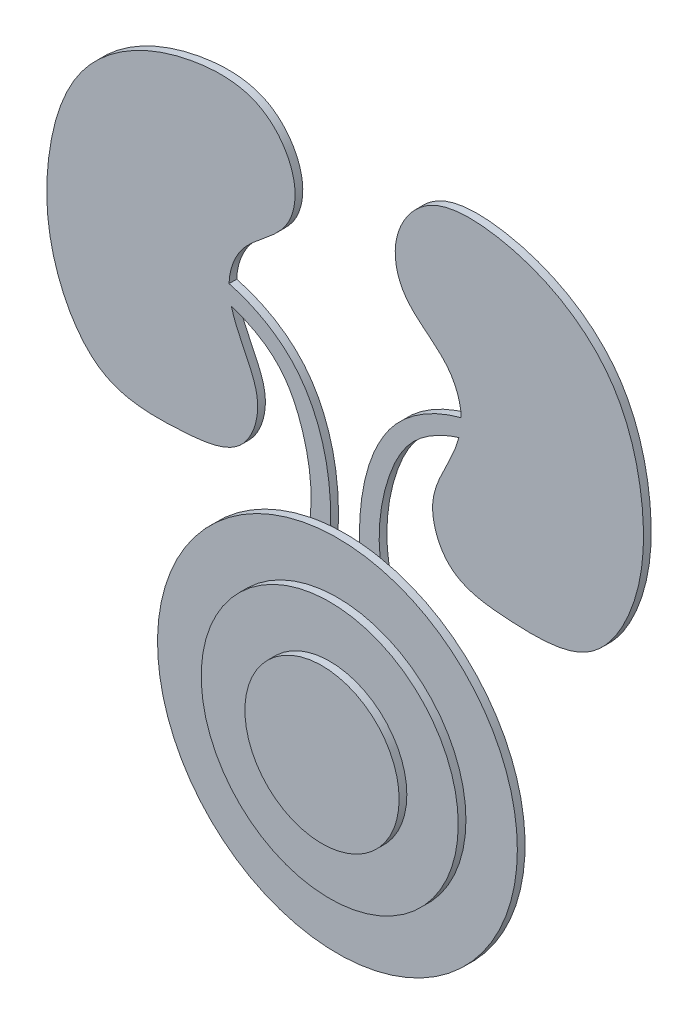
ISO-10303-21;
HEADER;
FILE_DESCRIPTION(('STEP AP214'),'2;1');
FILE_NAME('part.step','',(''),(''),'','','');
FILE_SCHEMA(('AUTOMOTIVE_DESIGN { 1 0 10303 214 1 1 1 1 }'));
ENDSEC;
DATA;
#1=APPLICATION_CONTEXT('core data for automotive mechanical design processes');
#2=APPLICATION_PROTOCOL_DEFINITION('international standard','automotive_design',2000,#1);
#3=PRODUCT_CONTEXT('',#1,'mechanical');
#4=PRODUCT('Part','Part','',(#3));
#5=PRODUCT_RELATED_PRODUCT_CATEGORY('part','',(#4));
#6=PRODUCT_DEFINITION_FORMATION('','',#4);
#7=PRODUCT_DEFINITION_CONTEXT('part definition',#1,'design');
#8=PRODUCT_DEFINITION('design','',#6,#7);
#9=PRODUCT_DEFINITION_SHAPE('','',#8);
#10=(LENGTH_UNIT() NAMED_UNIT(*) SI_UNIT(.MILLI.,.METRE.));
#11=(NAMED_UNIT(*) PLANE_ANGLE_UNIT() SI_UNIT($,.RADIAN.));
#12=(NAMED_UNIT(*) SI_UNIT($,.STERADIAN.) SOLID_ANGLE_UNIT());
#13=UNCERTAINTY_MEASURE_WITH_UNIT(LENGTH_MEASURE(1.E-05),#10,'distance_accuracy_value','');
#14=(GEOMETRIC_REPRESENTATION_CONTEXT(3) GLOBAL_UNCERTAINTY_ASSIGNED_CONTEXT((#13)) GLOBAL_UNIT_ASSIGNED_CONTEXT((#10,
#11,#12)) REPRESENTATION_CONTEXT('',''));
#15=CARTESIAN_POINT('',(0.,0.,0.));
#16=DIRECTION('',(0.,0.,1.));
#17=DIRECTION('',(1.,0.,0.));
#18=AXIS2_PLACEMENT_3D('',#15,#16,#17);
#19=CARTESIAN_POINT('',(-9.72641036774746,-28.6008671319991,-3.));
#20=CARTESIAN_POINT('',(-6.62218246305213,-15.5932633905993,-3.));
#21=CARTESIAN_POINT('',(-4.06444870774678,3.85284465866499,-3.));
#22=CARTESIAN_POINT('',(-8.51745088980813,30.2587786231955,-3.));
#23=CARTESIAN_POINT('',(-19.2033270279585,51.8847771164205,-3.));
#24=CARTESIAN_POINT('',(-35.5749175991955,60.7058344037227,-3.));
#25=CARTESIAN_POINT('',(-45.1693890236413,63.2318053031753,-3.));
#26=B_SPLINE_CURVE_WITH_KNOTS('',3,(#19,#20,#21,#22,#23,#24,#25),.UNSPECIFIED.,.F.,.F.,(4,1,1,1,
4),(0.,0.366558686155692,0.523455340740616,0.727102845018313,1.),.UNSPECIFIED.);
#27=DIRECTION('',(0.,0.,1.));
#28=VECTOR('',#27,1.);
#29=SURFACE_OF_LINEAR_EXTRUSION('',#26,#28);
#30=CARTESIAN_POINT('',(-9.72641036774746,-28.6008671319991,0.));
#31=CARTESIAN_POINT('',(-6.62218246305213,-15.5932633905993,0.));
#32=CARTESIAN_POINT('',(-4.06444870774678,3.85284465866499,0.));
#33=CARTESIAN_POINT('',(-8.51745088980813,30.2587786231955,0.));
#34=CARTESIAN_POINT('',(-19.2033270279585,51.8847771164205,0.));
#35=CARTESIAN_POINT('',(-35.5749175991955,60.7058344037227,0.));
#36=CARTESIAN_POINT('',(-45.1693890236413,63.2318053031753,0.));
#37=B_SPLINE_CURVE_WITH_KNOTS('',3,(#30,#31,#32,#33,#34,#35,#36),.UNSPECIFIED.,.F.,.F.,(4,1,1,1,
4),(0.,0.366558686155692,0.523455340740616,0.727102845018313,1.),.UNSPECIFIED.);
#38=CARTESIAN_POINT('',(-9.72641036774746,-28.6008671319991,0.));
#39=VERTEX_POINT('',#38);
#40=CARTESIAN_POINT('',(-5.59542977148809,1.38331897960272,0.));
#41=VERTEX_POINT('',#40);
#42=EDGE_CURVE('E205',#39,#41,#37,.T.);
#43=ORIENTED_EDGE('',*,*,#42,.F.);
#44=DIRECTION('',(0.,0.,1.));
#45=VECTOR('',#44,1.);
#46=CARTESIAN_POINT('',(-9.72641036774746,-28.6008671319991,-3.));
#47=LINE('',#46,#45);
#48=CARTESIAN_POINT('',(-9.72641036774746,-28.6008671319991,-3.));
#49=VERTEX_POINT('',#48);
#50=EDGE_CURVE('E234',#49,#39,#47,.T.);
#51=ORIENTED_EDGE('',*,*,#50,.F.);
#52=CARTESIAN_POINT('',(-45.1693890236413,63.2318053031753,-3.));
#53=VERTEX_POINT('',#52);
#54=EDGE_CURVE('E233',#49,#53,#26,.T.);
#55=ORIENTED_EDGE('',*,*,#54,.T.);
#56=DIRECTION('',(0.,0.,1.));
#57=VECTOR('',#56,1.);
#58=CARTESIAN_POINT('',(-45.1693890236413,63.2318053031753,-3.));
#59=LINE('',#58,#57);
#60=CARTESIAN_POINT('',(-45.1693890236413,63.2318053031753,0.));
#61=VERTEX_POINT('',#60);
#62=EDGE_CURVE('E36',#53,#61,#59,.T.);
#63=ORIENTED_EDGE('',*,*,#62,.T.);
#64=EDGE_CURVE('E211',#41,#61,#37,.T.);
#65=ORIENTED_EDGE('',*,*,#64,.F.);
#66=EDGE_LOOP('',(#43,#51,#55,#63,#65));
#67=FACE_BOUND('',#66,.T.);
#68=ADVANCED_FACE('F32',(#67),#29,.T.);
#69=CARTESIAN_POINT('',(-28.8302910399665,-28.6008671319991,-3.));
#70=DIRECTION('',(0.,-1.,0.));
#71=DIRECTION('',(0.,0.,-1.));
#72=AXIS2_PLACEMENT_3D('',#69,#70,#71);
#73=PLANE('',#72);
#74=DIRECTION('',(1.,0.,0.));
#75=VECTOR('',#74,1.);
#76=CARTESIAN_POINT('',(-28.8302910399665,-28.6008671319991,0.));
#77=LINE('',#76,#75);
#78=CARTESIAN_POINT('',(-28.8302910399665,-28.6008671319991,0.));
#79=VERTEX_POINT('',#78);
#80=EDGE_CURVE('E227',#79,#39,#77,.T.);
#81=ORIENTED_EDGE('',*,*,#80,.F.);
#82=DIRECTION('',(0.,0.,1.));
#83=VECTOR('',#82,1.);
#84=CARTESIAN_POINT('',(-28.8302910399665,-28.6008671319991,-3.));
#85=LINE('',#84,#83);
#86=CARTESIAN_POINT('',(-28.8302910399665,-28.6008671319991,-3.));
#87=VERTEX_POINT('',#86);
#88=EDGE_CURVE('E236',#87,#79,#85,.T.);
#89=ORIENTED_EDGE('',*,*,#88,.F.);
#90=DIRECTION('',(1.,0.,0.));
#91=VECTOR('',#90,1.);
#92=CARTESIAN_POINT('',(-28.8302910399665,-28.6008671319991,-3.));
#93=LINE('',#92,#91);
#94=EDGE_CURVE('E195',#87,#49,#93,.T.);
#95=ORIENTED_EDGE('',*,*,#94,.T.);
#96=ORIENTED_EDGE('',*,*,#50,.T.);
#97=EDGE_LOOP('',(#81,#89,#95,#96));
#98=FACE_BOUND('',#97,.T.);
#99=ADVANCED_FACE('F180',(#98),#73,.T.);
#100=CARTESIAN_POINT('',(-44.2621894787568,56.0743364533525,-3.));
#101=CARTESIAN_POINT('',(-37.4028304982198,53.9422112424001,-3.));
#102=CARTESIAN_POINT('',(-24.634464841534,47.1682272032282,-3.));
#103=CARTESIAN_POINT('',(-16.17232434167,28.9793591107932,-3.));
#104=CARTESIAN_POINT('',(-10.9167349626805,2.77332381243089,-3.));
#105=CARTESIAN_POINT('',(-16.0524982142524,-18.6420445965342,-3.));
#106=CARTESIAN_POINT('',(-28.8302910399665,-28.6008671319991,-3.));
#107=B_SPLINE_CURVE_WITH_KNOTS('',3,(#100,#101,#102,#103,#104,#105,#106),.UNSPECIFIED.,.F.,.F.,
(4,1,1,1,4),(0.,0.21497347092577,0.398290673940927,0.567935203120351,1.),.UNSPECIFIED.);
#108=DIRECTION('',(0.,0.,1.));
#109=VECTOR('',#108,1.);
#110=SURFACE_OF_LINEAR_EXTRUSION('',#107,#109);
#111=CARTESIAN_POINT('',(-44.2621894787568,56.0743364533525,0.));
#112=CARTESIAN_POINT('',(-37.4028304982198,53.9422112424001,0.));
#113=CARTESIAN_POINT('',(-24.634464841534,47.1682272032282,0.));
#114=CARTESIAN_POINT('',(-16.17232434167,28.9793591107932,0.));
#115=CARTESIAN_POINT('',(-10.9167349626805,2.77332381243089,0.));
#116=CARTESIAN_POINT('',(-16.0524982142524,-18.6420445965342,0.));
#117=CARTESIAN_POINT('',(-28.8302910399665,-28.6008671319991,0.));
#118=B_SPLINE_CURVE_WITH_KNOTS('',3,(#111,#112,#113,#114,#115,#116,#117),.UNSPECIFIED.,.F.,.F.,
(4,1,1,1,4),(0.,0.21497347092577,0.398290673940927,0.567935203120351,1.),.UNSPECIFIED.);
#119=CARTESIAN_POINT('',(-44.2621894787568,56.0743364533525,0.));
#120=VERTEX_POINT('',#119);
#121=CARTESIAN_POINT('',(-13.5891816012808,0.275602556858615,0.));
#122=VERTEX_POINT('',#121);
#123=EDGE_CURVE('E220',#120,#122,#118,.T.);
#124=ORIENTED_EDGE('',*,*,#123,.F.);
#125=DIRECTION('',(0.,0.,1.));
#126=VECTOR('',#125,1.);
#127=CARTESIAN_POINT('',(-44.2621894787568,56.0743364533525,-3.));
#128=LINE('',#127,#126);
#129=CARTESIAN_POINT('',(-44.2621894787568,56.0743364533525,-3.));
#130=VERTEX_POINT('',#129);
#131=EDGE_CURVE('E237',#130,#120,#128,.T.);
#132=ORIENTED_EDGE('',*,*,#131,.F.);
#133=EDGE_CURVE('E189',#130,#87,#107,.T.);
#134=ORIENTED_EDGE('',*,*,#133,.T.);
#135=ORIENTED_EDGE('',*,*,#88,.T.);
#136=EDGE_CURVE('E219',#122,#79,#118,.T.);
#137=ORIENTED_EDGE('',*,*,#136,.F.);
#138=EDGE_LOOP('',(#124,#132,#134,#135,#137));
#139=FACE_BOUND('',#138,.T.);
#140=ADVANCED_FACE('F183',(#139),#110,.T.);
#141=CARTESIAN_POINT('',(-45.1693890236413,63.2318053031753,-3.));
#142=CARTESIAN_POINT('',(-45.0391684455493,68.0403637551792,-3.));
#143=CARTESIAN_POINT('',(-41.3329305758843,78.400419332022,-3.));
#144=CARTESIAN_POINT('',(-30.3374594366744,85.806682659387,-3.));
#145=CARTESIAN_POINT('',(-21.0627458937639,95.0711402299289,-3.));
#146=CARTESIAN_POINT('',(-17.2403473802928,111.229787874986,-3.));
#147=CARTESIAN_POINT('',(-30.5543207930408,132.390797273261,-3.));
#148=CARTESIAN_POINT('',(-67.3101733931259,133.246136143813,-3.));
#149=CARTESIAN_POINT('',(-105.166028049356,112.881554325936,-3.));
#150=CARTESIAN_POINT('',(-117.515056312144,70.292497895126,-3.));
#151=CARTESIAN_POINT('',(-115.528314454251,35.5566532090719,-3.));
#152=CARTESIAN_POINT('',(-96.7466017878416,3.68766316983507,-3.));
#153=CARTESIAN_POINT('',(-66.0069622330079,3.738210195369,-3.));
#154=CARTESIAN_POINT('',(-39.381914285852,6.61593622916361,-3.));
#155=CARTESIAN_POINT('',(-31.4333190447439,28.8172436614804,-3.));
#156=CARTESIAN_POINT('',(-39.0169671589218,43.0563558660529,-3.));
#157=CARTESIAN_POINT('',(-43.2555509245764,52.2634267211149,-3.));
#158=CARTESIAN_POINT('',(-44.2621894787568,56.0743364533525,-3.));
#159=B_SPLINE_CURVE_WITH_KNOTS('',3,(#141,#142,#143,#144,#145,#146,#147,#148,#149,#150,#151,
#152,#153,#154,#155,#156,#157,#158),.UNSPECIFIED.,.F.,.F.,(4,1,1,1,1,1,1,1,1,1,1,1,1,1,1,4),(0.,
0.0391849444639621,0.0818216809312183,0.105864748649241,0.144209491523901,0.207235500318707,
0.277955383142157,0.419781588906366,0.522441226819374,0.6179761615148,0.703158760983669,
0.786788828058679,0.852004592736441,0.901057908790077,0.948239720504144,0.980255044878912),.UNSPECIFIED.);
#160=DIRECTION('',(0.,0.,1.));
#161=VECTOR('',#160,1.);
#162=SURFACE_OF_LINEAR_EXTRUSION('',#159,#161);
#163=CARTESIAN_POINT('',(-45.1693890236413,63.2318053031753,0.));
#164=CARTESIAN_POINT('',(-45.0391684455493,68.0403637551792,0.));
#165=CARTESIAN_POINT('',(-41.3329305758843,78.400419332022,0.));
#166=CARTESIAN_POINT('',(-30.3374594366744,85.806682659387,0.));
#167=CARTESIAN_POINT('',(-21.0627458937639,95.0711402299289,0.));
#168=CARTESIAN_POINT('',(-17.2403473802928,111.229787874986,0.));
#169=CARTESIAN_POINT('',(-30.5543207930408,132.390797273261,0.));
#170=CARTESIAN_POINT('',(-67.3101733931259,133.246136143813,0.));
#171=CARTESIAN_POINT('',(-105.166028049356,112.881554325936,0.));
#172=CARTESIAN_POINT('',(-117.515056312144,70.292497895126,0.));
#173=CARTESIAN_POINT('',(-115.528314454251,35.5566532090719,0.));
#174=CARTESIAN_POINT('',(-96.7466017878416,3.68766316983507,0.));
#175=CARTESIAN_POINT('',(-66.0069622330079,3.738210195369,0.));
#176=CARTESIAN_POINT('',(-39.381914285852,6.61593622916361,0.));
#177=CARTESIAN_POINT('',(-31.4333190447439,28.8172436614804,0.));
#178=CARTESIAN_POINT('',(-39.0169671589218,43.0563558660529,0.));
#179=CARTESIAN_POINT('',(-43.2555509245764,52.2634267211149,0.));
#180=CARTESIAN_POINT('',(-44.2621894787568,56.0743364533525,0.));
#181=B_SPLINE_CURVE_WITH_KNOTS('',3,(#163,#164,#165,#166,#167,#168,#169,#170,#171,#172,#173,
#174,#175,#176,#177,#178,#179,#180),.UNSPECIFIED.,.F.,.F.,(4,1,1,1,1,1,1,1,1,1,1,1,1,1,1,4),(0.,
0.0391849444639621,0.0818216809312183,0.105864748649241,0.144209491523901,0.207235500318707,
0.277955383142157,0.419781588906366,0.522441226819374,0.6179761615148,0.703158760983669,
0.786788828058679,0.852004592736441,0.901057908790077,0.948239720504144,0.980255044878912),.UNSPECIFIED.);
#182=EDGE_CURVE('E210',#61,#120,#181,.T.);
#183=ORIENTED_EDGE('',*,*,#182,.F.);
#184=ORIENTED_EDGE('',*,*,#62,.F.);
#185=EDGE_CURVE('E196',#53,#130,#159,.T.);
#186=ORIENTED_EDGE('',*,*,#185,.T.);
#187=ORIENTED_EDGE('',*,*,#131,.T.);
#188=EDGE_LOOP('',(#183,#184,#186,#187));
#189=FACE_BOUND('',#188,.T.);
#190=ADVANCED_FACE('F175',(#189),#162,.T.);
#191=CARTESIAN_POINT('',(-8.25327299243568,25.9139475099056,-3.));
#192=DIRECTION('',(0.,0.,1.));
#193=DIRECTION('',(1.,0.,0.));
#194=AXIS2_PLACEMENT_3D('',#191,#192,#193);
#195=PLANE('',#194);
#196=ORIENTED_EDGE('',*,*,#54,.F.);
#197=ORIENTED_EDGE('',*,*,#94,.F.);
#198=ORIENTED_EDGE('',*,*,#133,.F.);
#199=ORIENTED_EDGE('',*,*,#185,.F.);
#200=EDGE_LOOP('',(#196,#197,#198,#199));
#201=FACE_BOUND('',#200,.T.);
#202=ADVANCED_FACE('F172',(#201),#195,.F.);
#203=CARTESIAN_POINT('',(-8.25327299243568,25.9139475099056,0.));
#204=DIRECTION('',(0.,0.,1.));
#205=DIRECTION('',(1.,0.,0.));
#206=AXIS2_PLACEMENT_3D('',#203,#204,#205);
#207=PLANE('',#206);
#208=CARTESIAN_POINT('',(0.,-68.3926881121788,0.));
#209=DIRECTION('',(0.,0.,1.));
#210=DIRECTION('',(1.,0.,0.));
#211=AXIS2_PLACEMENT_3D('',#208,#209,#210);
#212=CIRCLE('',#211,70.);
#213=EDGE_CURVE('E250',#41,#122,#212,.T.);
#214=ORIENTED_EDGE('',*,*,#213,.F.);
#215=ORIENTED_EDGE('',*,*,#64,.T.);
#216=ORIENTED_EDGE('',*,*,#182,.T.);
#217=ORIENTED_EDGE('',*,*,#123,.T.);
#218=EDGE_LOOP('',(#214,#215,#216,#217));
#219=FACE_BOUND('',#218,.T.);
#220=ADVANCED_FACE('F167',(#219),#207,.T.);
#221=CARTESIAN_POINT('',(0.,-68.3926881121788,0.));
#222=DIRECTION('',(0.,0.,1.));
#223=DIRECTION('',(1.,0.,0.));
#224=AXIS2_PLACEMENT_3D('',#221,#222,#223);
#225=PLANE('',#224);
#226=DIRECTION('',(1.,0.,0.));
#227=VECTOR('',#226,1.);
#228=CARTESIAN_POINT('',(28.8302910399665,-28.600867131999,0.));
#229=LINE('',#228,#227);
#230=CARTESIAN_POINT('',(9.72641036774746,-28.600867131999,0.));
#231=VERTEX_POINT('',#230);
#232=CARTESIAN_POINT('',(28.8302910399665,-28.600867131999,0.));
#233=VERTEX_POINT('',#232);
#234=EDGE_CURVE('E286',#231,#233,#229,.T.);
#235=ORIENTED_EDGE('',*,*,#234,.T.);
#236=CARTESIAN_POINT('',(28.8302910399665,-28.600867131999,0.));
#237=CARTESIAN_POINT('',(16.0524982142524,-18.6420445965342,0.));
#238=CARTESIAN_POINT('',(10.9167349626806,2.77332381243089,0.));
#239=CARTESIAN_POINT('',(16.17232434167,28.9793591107932,0.));
#240=CARTESIAN_POINT('',(24.634464841534,47.1682272032282,0.));
#241=CARTESIAN_POINT('',(37.4028304982198,53.9422112424001,0.));
#242=CARTESIAN_POINT('',(44.2621894787568,56.0743364533525,0.));
#243=B_SPLINE_CURVE_WITH_KNOTS('',3,(#236,#237,#238,#239,#240,#241,#242),.UNSPECIFIED.,.F.,.F.,
(4,1,1,1,4),(0.,0.432064796879649,0.601709326059073,0.78502652907423,1.),.UNSPECIFIED.);
#244=CARTESIAN_POINT('',(13.5891816012809,0.275602556858612,0.));
#245=VERTEX_POINT('',#244);
#246=EDGE_CURVE('E136',#233,#245,#243,.T.);
#247=ORIENTED_EDGE('',*,*,#246,.T.);
#248=EDGE_CURVE('E256',#122,#245,#212,.T.);
#249=ORIENTED_EDGE('',*,*,#248,.F.);
#250=ORIENTED_EDGE('',*,*,#136,.T.);
#251=ORIENTED_EDGE('',*,*,#80,.T.);
#252=ORIENTED_EDGE('',*,*,#42,.T.);
#253=CARTESIAN_POINT('',(5.59542977148811,1.38331897960273,0.));
#254=VERTEX_POINT('',#253);
#255=EDGE_CURVE('E57',#254,#41,#212,.T.);
#256=ORIENTED_EDGE('',*,*,#255,.F.);
#257=CARTESIAN_POINT('',(45.1693890236413,63.2318053031753,0.));
#258=CARTESIAN_POINT('',(35.5749175991955,60.7058344037227,0.));
#259=CARTESIAN_POINT('',(19.2033270279585,51.8847771164205,0.));
#260=CARTESIAN_POINT('',(8.51745088980816,30.2587786231956,0.));
#261=CARTESIAN_POINT('',(4.0644487077468,3.85284465866498,0.));
#262=CARTESIAN_POINT('',(6.62218246305215,-15.5932633905993,0.));
#263=CARTESIAN_POINT('',(9.72641036774749,-28.600867131999,0.));
#264=B_SPLINE_CURVE_WITH_KNOTS('',3,(#257,#258,#259,#260,#261,#262,#263),.UNSPECIFIED.,.F.,.F.,
(4,1,1,1,4),(0.,0.272897154981687,0.476544659259384,0.633441313844308,1.),.UNSPECIFIED.);
#265=EDGE_CURVE('E284',#254,#231,#264,.T.);
#266=ORIENTED_EDGE('',*,*,#265,.T.);
#267=EDGE_LOOP('',(#235,#247,#249,#250,#251,#252,#256,#266));
#268=FACE_BOUND('',#267,.T.);
#269=ADVANCED_FACE('F164',(#268),#225,.F.);
#270=CARTESIAN_POINT('',(0.,-68.3926881121788,3.));
#271=DIRECTION('',(0.,0.,-1.));
#272=DIRECTION('',(-1.,0.,0.));
#273=AXIS2_PLACEMENT_3D('',#270,#271,#272);
#274=CYLINDRICAL_SURFACE('',#273,70.);
#275=CARTESIAN_POINT('',(0.,-68.3926881121788,3.));
#276=DIRECTION('',(0.,0.,1.));
#277=DIRECTION('',(1.,0.,0.));
#278=AXIS2_PLACEMENT_3D('',#275,#276,#277);
#279=CIRCLE('',#278,70.);
#280=CARTESIAN_POINT('',(70.,-68.3926881121788,3.));
#281=VERTEX_POINT('',#280);
#282=EDGE_CURVE('E251',#281,#281,#279,.T.);
#283=ORIENTED_EDGE('',*,*,#282,.F.);
#284=EDGE_LOOP('',(#283));
#285=FACE_BOUND('',#284,.T.);
#286=ORIENTED_EDGE('',*,*,#213,.T.);
#287=ORIENTED_EDGE('',*,*,#248,.T.);
#288=EDGE_CURVE('E273',#245,#254,#212,.T.);
#289=ORIENTED_EDGE('',*,*,#288,.T.);
#290=ORIENTED_EDGE('',*,*,#255,.T.);
#291=EDGE_LOOP('',(#286,#287,#289,#290));
#292=FACE_BOUND('',#291,.T.);
#293=ADVANCED_FACE('F162',(#285,#292),#274,.T.);
#294=CARTESIAN_POINT('',(0.,-68.3926881121788,3.));
#295=DIRECTION('',(0.,0.,1.));
#296=DIRECTION('',(1.,0.,0.));
#297=AXIS2_PLACEMENT_3D('',#294,#295,#296);
#298=PLANE('',#297);
#299=CARTESIAN_POINT('',(0.,-68.3926881121788,3.));
#300=DIRECTION('',(0.,0.,1.));
#301=DIRECTION('',(1.,0.,0.));
#302=AXIS2_PLACEMENT_3D('',#299,#300,#301);
#303=CIRCLE('',#302,50.);
#304=CARTESIAN_POINT('',(50.,-68.3926881121788,3.));
#305=VERTEX_POINT('',#304);
#306=EDGE_CURVE('E41',#305,#305,#303,.T.);
#307=ORIENTED_EDGE('',*,*,#306,.F.);
#308=EDGE_LOOP('',(#307));
#309=FACE_BOUND('',#308,.T.);
#310=ORIENTED_EDGE('',*,*,#282,.T.);
#311=EDGE_LOOP('',(#310));
#312=FACE_BOUND('',#311,.T.);
#313=ADVANCED_FACE('F158',(#309,#312),#298,.T.);
#314=CARTESIAN_POINT('',(44.2621894787568,56.0743364533525,-3.));
#315=CARTESIAN_POINT('',(43.2555509245764,52.2634267211149,-3.));
#316=CARTESIAN_POINT('',(39.0169671589218,43.0563558660529,-3.));
#317=CARTESIAN_POINT('',(31.4333190447439,28.8172436614804,-3.));
#318=CARTESIAN_POINT('',(39.381914285852,6.61593622916362,-3.));
#319=CARTESIAN_POINT('',(66.006962233008,3.73821019536902,-3.));
#320=CARTESIAN_POINT('',(96.7466017878416,3.6876631698351,-3.));
#321=CARTESIAN_POINT('',(115.528314454251,35.5566532090719,-3.));
#322=CARTESIAN_POINT('',(117.515056312144,70.292497895126,-3.));
#323=CARTESIAN_POINT('',(105.166028049356,112.881554325937,-3.));
#324=CARTESIAN_POINT('',(67.3101733931259,133.246136143813,-3.));
#325=CARTESIAN_POINT('',(30.5543207930407,132.390797273261,-3.));
#326=CARTESIAN_POINT('',(17.2403473802928,111.229787874986,-3.));
#327=CARTESIAN_POINT('',(21.0627458937639,95.0711402299289,-3.));
#328=CARTESIAN_POINT('',(30.3374594366744,85.8066826593871,-3.));
#329=CARTESIAN_POINT('',(41.3329305758843,78.400419332022,-3.));
#330=CARTESIAN_POINT('',(45.0391684455493,68.0403637551792,-3.));
#331=CARTESIAN_POINT('',(45.1693890236413,63.2318053031753,-3.));
#332=B_SPLINE_CURVE_WITH_KNOTS('',3,(#314,#315,#316,#317,#318,#319,#320,#321,#322,#323,#324,
#325,#326,#327,#328,#329,#330,#331),.UNSPECIFIED.,.F.,.F.,(4,1,1,1,1,1,1,1,1,1,1,1,1,1,1,4),(0.,
0.0320153243747687,0.0791971360888355,0.128250452142471,0.193466216820234,0.277096283895243,
0.362278883364112,0.457813818059538,0.560473455972546,0.702299661736756,0.773019544560205,
0.836045553355011,0.874390296229672,0.898433363947694,0.94107010041495,0.980255044878912),.UNSPECIFIED.);
#333=DIRECTION('',(0.,0.,1.));
#334=VECTOR('',#333,1.);
#335=SURFACE_OF_LINEAR_EXTRUSION('',#332,#334);
#336=CARTESIAN_POINT('',(44.2621894787568,56.0743364533525,0.));
#337=CARTESIAN_POINT('',(43.2555509245764,52.2634267211149,0.));
#338=CARTESIAN_POINT('',(39.0169671589218,43.0563558660529,0.));
#339=CARTESIAN_POINT('',(31.4333190447439,28.8172436614804,0.));
#340=CARTESIAN_POINT('',(39.381914285852,6.61593622916362,0.));
#341=CARTESIAN_POINT('',(66.006962233008,3.73821019536902,0.));
#342=CARTESIAN_POINT('',(96.7466017878416,3.6876631698351,0.));
#343=CARTESIAN_POINT('',(115.528314454251,35.5566532090719,0.));
#344=CARTESIAN_POINT('',(117.515056312144,70.292497895126,0.));
#345=CARTESIAN_POINT('',(105.166028049356,112.881554325937,0.));
#346=CARTESIAN_POINT('',(67.3101733931259,133.246136143813,0.));
#347=CARTESIAN_POINT('',(30.5543207930407,132.390797273261,0.));
#348=CARTESIAN_POINT('',(17.2403473802928,111.229787874986,0.));
#349=CARTESIAN_POINT('',(21.0627458937639,95.0711402299289,0.));
#350=CARTESIAN_POINT('',(30.3374594366744,85.8066826593871,0.));
#351=CARTESIAN_POINT('',(41.3329305758843,78.400419332022,0.));
#352=CARTESIAN_POINT('',(45.0391684455493,68.0403637551792,0.));
#353=CARTESIAN_POINT('',(45.1693890236413,63.2318053031753,0.));
#354=B_SPLINE_CURVE_WITH_KNOTS('',3,(#336,#337,#338,#339,#340,#341,#342,#343,#344,#345,#346,
#347,#348,#349,#350,#351,#352,#353),.UNSPECIFIED.,.F.,.F.,(4,1,1,1,1,1,1,1,1,1,1,1,1,1,1,4),(0.,
0.0320153243747687,0.0791971360888355,0.128250452142471,0.193466216820234,0.277096283895243,
0.362278883364112,0.457813818059538,0.560473455972546,0.702299661736756,0.773019544560205,
0.836045553355011,0.874390296229672,0.898433363947694,0.94107010041495,0.980255044878912),.UNSPECIFIED.);
#355=CARTESIAN_POINT('',(44.2621894787568,56.0743364533525,0.));
#356=VERTEX_POINT('',#355);
#357=CARTESIAN_POINT('',(45.1693890236413,63.2318053031753,0.));
#358=VERTEX_POINT('',#357);
#359=EDGE_CURVE('E288',#356,#358,#354,.T.);
#360=ORIENTED_EDGE('',*,*,#359,.F.);
#361=DIRECTION('',(0.,0.,1.));
#362=VECTOR('',#361,1.);
#363=CARTESIAN_POINT('',(44.2621894787568,56.0743364533525,-3.));
#364=LINE('',#363,#362);
#365=CARTESIAN_POINT('',(44.2621894787568,56.0743364533525,-3.));
#366=VERTEX_POINT('',#365);
#367=EDGE_CURVE('E135',#366,#356,#364,.T.);
#368=ORIENTED_EDGE('',*,*,#367,.F.);
#369=CARTESIAN_POINT('',(45.1693890236413,63.2318053031753,-3.));
#370=VERTEX_POINT('',#369);
#371=EDGE_CURVE('E128',#366,#370,#332,.T.);
#372=ORIENTED_EDGE('',*,*,#371,.T.);
#373=DIRECTION('',(0.,0.,1.));
#374=VECTOR('',#373,1.);
#375=CARTESIAN_POINT('',(45.1693890236413,63.2318053031753,-3.));
#376=LINE('',#375,#374);
#377=EDGE_CURVE('E113',#370,#358,#376,.T.);
#378=ORIENTED_EDGE('',*,*,#377,.T.);
#379=EDGE_LOOP('',(#360,#368,#372,#378));
#380=FACE_BOUND('',#379,.T.);
#381=ADVANCED_FACE('F133',(#380),#335,.T.);
#382=CARTESIAN_POINT('',(28.8302910399665,-28.600867131999,-3.));
#383=CARTESIAN_POINT('',(16.0524982142524,-18.6420445965342,-3.));
#384=CARTESIAN_POINT('',(10.9167349626806,2.77332381243089,-3.));
#385=CARTESIAN_POINT('',(16.17232434167,28.9793591107932,-3.));
#386=CARTESIAN_POINT('',(24.634464841534,47.1682272032282,-3.));
#387=CARTESIAN_POINT('',(37.4028304982198,53.9422112424001,-3.));
#388=CARTESIAN_POINT('',(44.2621894787568,56.0743364533525,-3.));
#389=B_SPLINE_CURVE_WITH_KNOTS('',3,(#382,#383,#384,#385,#386,#387,#388),.UNSPECIFIED.,.F.,.F.,
(4,1,1,1,4),(0.,0.432064796879649,0.601709326059073,0.78502652907423,1.),.UNSPECIFIED.);
#390=DIRECTION('',(0.,0.,1.));
#391=VECTOR('',#390,1.);
#392=SURFACE_OF_LINEAR_EXTRUSION('',#389,#391);
#393=ORIENTED_EDGE('',*,*,#246,.F.);
#394=DIRECTION('',(0.,0.,1.));
#395=VECTOR('',#394,1.);
#396=CARTESIAN_POINT('',(28.8302910399665,-28.600867131999,-3.));
#397=LINE('',#396,#395);
#398=CARTESIAN_POINT('',(28.8302910399665,-28.600867131999,-3.));
#399=VERTEX_POINT('',#398);
#400=EDGE_CURVE('E274',#399,#233,#397,.T.);
#401=ORIENTED_EDGE('',*,*,#400,.F.);
#402=EDGE_CURVE('E121',#399,#366,#389,.T.);
#403=ORIENTED_EDGE('',*,*,#402,.T.);
#404=ORIENTED_EDGE('',*,*,#367,.T.);
#405=EDGE_CURVE('E139',#245,#356,#243,.T.);
#406=ORIENTED_EDGE('',*,*,#405,.F.);
#407=EDGE_LOOP('',(#393,#401,#403,#404,#406));
#408=FACE_BOUND('',#407,.T.);
#409=ADVANCED_FACE('F157',(#408),#392,.T.);
#410=CARTESIAN_POINT('',(28.8302910399665,-28.600867131999,-3.));
#411=DIRECTION('',(0.,-1.,0.));
#412=DIRECTION('',(0.,0.,-1.));
#413=AXIS2_PLACEMENT_3D('',#410,#411,#412);
#414=PLANE('',#413);
#415=ORIENTED_EDGE('',*,*,#234,.F.);
#416=DIRECTION('',(0.,0.,1.));
#417=VECTOR('',#416,1.);
#418=CARTESIAN_POINT('',(9.72641036774746,-28.600867131999,-3.));
#419=LINE('',#418,#417);
#420=CARTESIAN_POINT('',(9.72641036774746,-28.600867131999,-3.));
#421=VERTEX_POINT('',#420);
#422=EDGE_CURVE('E120',#421,#231,#419,.T.);
#423=ORIENTED_EDGE('',*,*,#422,.F.);
#424=DIRECTION('',(1.,0.,0.));
#425=VECTOR('',#424,1.);
#426=CARTESIAN_POINT('',(28.8302910399665,-28.600867131999,-3.));
#427=LINE('',#426,#425);
#428=EDGE_CURVE('E131',#421,#399,#427,.T.);
#429=ORIENTED_EDGE('',*,*,#428,.T.);
#430=ORIENTED_EDGE('',*,*,#400,.T.);
#431=EDGE_LOOP('',(#415,#423,#429,#430));
#432=FACE_BOUND('',#431,.T.);
#433=ADVANCED_FACE('F287',(#432),#414,.T.);
#434=CARTESIAN_POINT('',(45.1693890236413,63.2318053031753,-3.));
#435=CARTESIAN_POINT('',(35.5749175991955,60.7058344037227,-3.));
#436=CARTESIAN_POINT('',(19.2033270279585,51.8847771164205,-3.));
#437=CARTESIAN_POINT('',(8.51745088980816,30.2587786231956,-3.));
#438=CARTESIAN_POINT('',(4.0644487077468,3.85284465866498,-3.));
#439=CARTESIAN_POINT('',(6.62218246305215,-15.5932633905993,-3.));
#440=CARTESIAN_POINT('',(9.72641036774749,-28.600867131999,-3.));
#441=B_SPLINE_CURVE_WITH_KNOTS('',3,(#434,#435,#436,#437,#438,#439,#440),.UNSPECIFIED.,.F.,.F.,
(4,1,1,1,4),(0.,0.272897154981687,0.476544659259384,0.633441313844308,1.),.UNSPECIFIED.);
#442=DIRECTION('',(0.,0.,1.));
#443=VECTOR('',#442,1.);
#444=SURFACE_OF_LINEAR_EXTRUSION('',#441,#443);
#445=EDGE_CURVE('E49',#358,#254,#264,.T.);
#446=ORIENTED_EDGE('',*,*,#445,.F.);
#447=ORIENTED_EDGE('',*,*,#377,.F.);
#448=EDGE_CURVE('E116',#370,#421,#441,.T.);
#449=ORIENTED_EDGE('',*,*,#448,.T.);
#450=ORIENTED_EDGE('',*,*,#422,.T.);
#451=ORIENTED_EDGE('',*,*,#265,.F.);
#452=EDGE_LOOP('',(#446,#447,#449,#450,#451));
#453=FACE_BOUND('',#452,.T.);
#454=ADVANCED_FACE('F115',(#453),#444,.T.);
#455=CARTESIAN_POINT('',(113.399110418185,81.506643761379,-3.));
#456=DIRECTION('',(0.,0.,-1.));
#457=DIRECTION('',(-1.,0.,0.));
#458=AXIS2_PLACEMENT_3D('',#455,#456,#457);
#459=PLANE('',#458);
#460=ORIENTED_EDGE('',*,*,#371,.F.);
#461=ORIENTED_EDGE('',*,*,#402,.F.);
#462=ORIENTED_EDGE('',*,*,#428,.F.);
#463=ORIENTED_EDGE('',*,*,#448,.F.);
#464=EDGE_LOOP('',(#460,#461,#462,#463));
#465=FACE_BOUND('',#464,.T.);
#466=ADVANCED_FACE('F126',(#465),#459,.T.);
#467=CARTESIAN_POINT('',(113.399110418185,81.506643761379,0.));
#468=DIRECTION('',(0.,0.,-1.));
#469=DIRECTION('',(-1.,0.,0.));
#470=AXIS2_PLACEMENT_3D('',#467,#468,#469);
#471=PLANE('',#470);
#472=ORIENTED_EDGE('',*,*,#445,.T.);
#473=ORIENTED_EDGE('',*,*,#288,.F.);
#474=ORIENTED_EDGE('',*,*,#405,.T.);
#475=ORIENTED_EDGE('',*,*,#359,.T.);
#476=EDGE_LOOP('',(#472,#473,#474,#475));
#477=FACE_BOUND('',#476,.T.);
#478=ADVANCED_FACE('F312',(#477),#471,.F.);
#479=CARTESIAN_POINT('',(0.,-68.3926881121788,6.));
#480=DIRECTION('',(0.,0.,-1.));
#481=DIRECTION('',(-1.,0.,0.));
#482=AXIS2_PLACEMENT_3D('',#479,#480,#481);
#483=CYLINDRICAL_SURFACE('',#482,50.);
#484=CARTESIAN_POINT('',(0.,-68.3926881121788,6.));
#485=DIRECTION('',(0.,0.,1.));
#486=DIRECTION('',(1.,0.,0.));
#487=AXIS2_PLACEMENT_3D('',#484,#485,#486);
#488=CIRCLE('',#487,50.);
#489=CARTESIAN_POINT('',(50.,-68.3926881121788,6.));
#490=VERTEX_POINT('',#489);
#491=EDGE_CURVE('E290',#490,#490,#488,.T.);
#492=ORIENTED_EDGE('',*,*,#491,.F.);
#493=EDGE_LOOP('',(#492));
#494=FACE_BOUND('',#493,.T.);
#495=ORIENTED_EDGE('',*,*,#306,.T.);
#496=EDGE_LOOP('',(#495));
#497=FACE_BOUND('',#496,.T.);
#498=ADVANCED_FACE('F388',(#494,#497),#483,.T.);
#499=CARTESIAN_POINT('',(0.,-68.3926881121788,6.));
#500=DIRECTION('',(0.,0.,1.));
#501=DIRECTION('',(1.,0.,0.));
#502=AXIS2_PLACEMENT_3D('',#499,#500,#501);
#503=PLANE('',#502);
#504=CARTESIAN_POINT('',(0.,-68.3926881121788,6.));
#505=DIRECTION('',(0.,0.,1.));
#506=DIRECTION('',(1.,0.,0.));
#507=AXIS2_PLACEMENT_3D('',#504,#505,#506);
#508=CIRCLE('',#507,30.);
#509=CARTESIAN_POINT('',(30.,-68.3926881121788,6.));
#510=VERTEX_POINT('',#509);
#511=EDGE_CURVE('E11',#510,#510,#508,.T.);
#512=ORIENTED_EDGE('',*,*,#511,.F.);
#513=EDGE_LOOP('',(#512));
#514=FACE_BOUND('',#513,.T.);
#515=ORIENTED_EDGE('',*,*,#491,.T.);
#516=EDGE_LOOP('',(#515));
#517=FACE_BOUND('',#516,.T.);
#518=ADVANCED_FACE('F395',(#514,#517),#503,.T.);
#519=CARTESIAN_POINT('',(0.,-68.3926881121788,9.));
#520=DIRECTION('',(0.,0.,-1.));
#521=DIRECTION('',(-1.,0.,0.));
#522=AXIS2_PLACEMENT_3D('',#519,#520,#521);
#523=CYLINDRICAL_SURFACE('',#522,30.);
#524=CARTESIAN_POINT('',(0.,-68.3926881121788,9.));
#525=DIRECTION('',(0.,0.,1.));
#526=DIRECTION('',(1.,0.,0.));
#527=AXIS2_PLACEMENT_3D('',#524,#525,#526);
#528=CIRCLE('',#527,30.);
#529=CARTESIAN_POINT('',(30.,-68.3926881121788,9.));
#530=VERTEX_POINT('',#529);
#531=EDGE_CURVE('E438',#530,#530,#528,.T.);
#532=ORIENTED_EDGE('',*,*,#531,.F.);
#533=EDGE_LOOP('',(#532));
#534=FACE_BOUND('',#533,.T.);
#535=ORIENTED_EDGE('',*,*,#511,.T.);
#536=EDGE_LOOP('',(#535));
#537=FACE_BOUND('',#536,.T.);
#538=ADVANCED_FACE('F403',(#534,#537),#523,.T.);
#539=CARTESIAN_POINT('',(0.,-68.3926881121788,9.));
#540=DIRECTION('',(0.,0.,1.));
#541=DIRECTION('',(1.,0.,0.));
#542=AXIS2_PLACEMENT_3D('',#539,#540,#541);
#543=PLANE('',#542);
#544=ORIENTED_EDGE('',*,*,#531,.T.);
#545=EDGE_LOOP('',(#544));
#546=FACE_BOUND('',#545,.T.);
#547=ADVANCED_FACE('F411',(#546),#543,.T.);
#548=CLOSED_SHELL('',(#68,#99,#140,#190,#202,#220,#269,#293,#313,#381,#409,#433,#454,#466,#478,
#498,#518,#538,#547));
#549=MANIFOLD_SOLID_BREP('B2',#548);
#550=ADVANCED_BREP_SHAPE_REPRESENTATION('',(#18,#549),#14);
#551=SHAPE_DEFINITION_REPRESENTATION(#9,#550);
ENDSEC;
END-ISO-10303-21;
